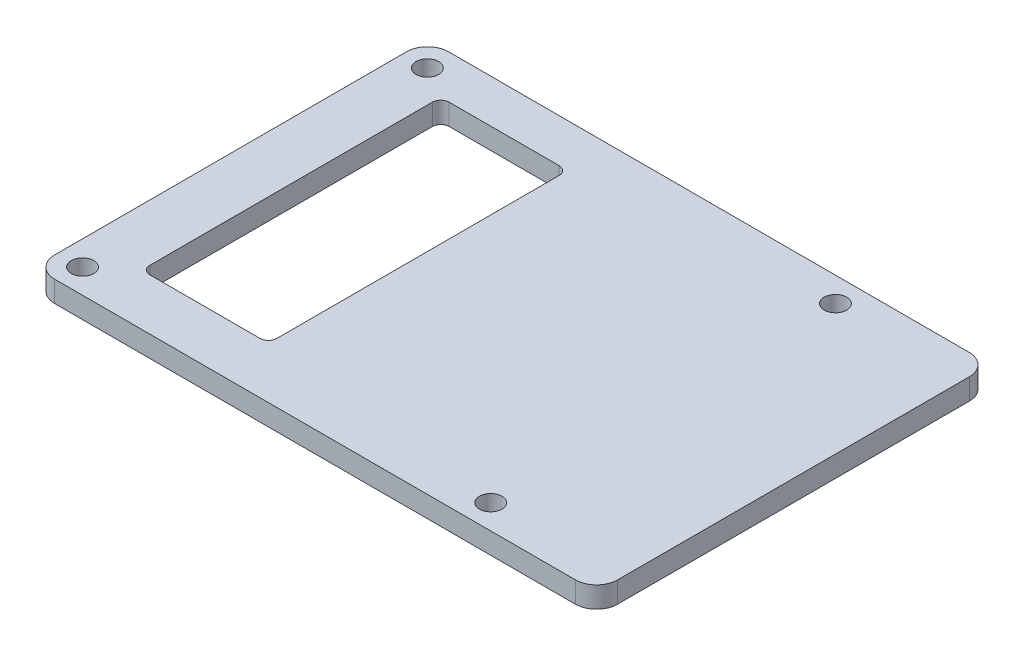
ISO-10303-21;
HEADER;
FILE_DESCRIPTION(('STEP AP214'),'2;1');
FILE_NAME('part.step','',(''),(''),'','','');
FILE_SCHEMA(('AUTOMOTIVE_DESIGN { 1 0 10303 214 1 1 1 1 }'));
ENDSEC;
DATA;
#1=APPLICATION_CONTEXT('core data for automotive mechanical design processes');
#2=APPLICATION_PROTOCOL_DEFINITION('international standard','automotive_design',2000,#1);
#3=PRODUCT_CONTEXT('',#1,'mechanical');
#4=PRODUCT('Part','Part','',(#3));
#5=PRODUCT_RELATED_PRODUCT_CATEGORY('part','',(#4));
#6=PRODUCT_DEFINITION_FORMATION('','',#4);
#7=PRODUCT_DEFINITION_CONTEXT('part definition',#1,'design');
#8=PRODUCT_DEFINITION('design','',#6,#7);
#9=PRODUCT_DEFINITION_SHAPE('','',#8);
#10=(LENGTH_UNIT() NAMED_UNIT(*) SI_UNIT(.MILLI.,.METRE.));
#11=(NAMED_UNIT(*) PLANE_ANGLE_UNIT() SI_UNIT($,.RADIAN.));
#12=(NAMED_UNIT(*) SI_UNIT($,.STERADIAN.) SOLID_ANGLE_UNIT());
#13=UNCERTAINTY_MEASURE_WITH_UNIT(LENGTH_MEASURE(1.E-05),#10,'distance_accuracy_value','');
#14=(GEOMETRIC_REPRESENTATION_CONTEXT(3) GLOBAL_UNCERTAINTY_ASSIGNED_CONTEXT((#13)) GLOBAL_UNIT_ASSIGNED_CONTEXT((#10,
#11,#12)) REPRESENTATION_CONTEXT('',''));
#15=CARTESIAN_POINT('',(0.,0.,0.));
#16=DIRECTION('',(0.,0.,1.));
#17=DIRECTION('',(1.,0.,0.));
#18=AXIS2_PLACEMENT_3D('',#15,#16,#17);
#19=CARTESIAN_POINT('',(-77.0217231267692,3.,-21.4026703774337));
#20=DIRECTION('',(0.,1.,0.));
#21=DIRECTION('',(0.,0.,1.));
#22=AXIS2_PLACEMENT_3D('',#19,#20,#21);
#23=PLANE('',#22);
#24=CARTESIAN_POINT('',(-18.5283322199872,3.,28.1136567752183));
#25=DIRECTION('',(0.,1.,0.));
#26=DIRECTION('',(0.,0.,1.));
#27=AXIS2_PLACEMENT_3D('',#24,#25,#26);
#28=CIRCLE('',#27,1.6);
#29=CARTESIAN_POINT('',(-18.5283322199872,3.,29.7136567752183));
#30=VERTEX_POINT('',#29);
#31=EDGE_CURVE('E223',#30,#30,#28,.T.);
#32=ORIENTED_EDGE('',*,*,#31,.F.);
#33=EDGE_LOOP('',(#32));
#34=FACE_BOUND('',#33,.T.);
#35=CARTESIAN_POINT('',(-76.5284846202892,3.,-20.8867242255417));
#36=DIRECTION('',(0.,1.,0.));
#37=DIRECTION('',(0.,0.,1.));
#38=AXIS2_PLACEMENT_3D('',#35,#36,#37);
#39=CIRCLE('',#38,1.6);
#40=CARTESIAN_POINT('',(-76.5284846202892,3.,-19.2867242255417));
#41=VERTEX_POINT('',#40);
#42=EDGE_CURVE('E235',#41,#41,#39,.T.);
#43=ORIENTED_EDGE('',*,*,#42,.F.);
#44=EDGE_LOOP('',(#43));
#45=FACE_BOUND('',#44,.T.);
#46=CARTESIAN_POINT('',(-77.0217231267692,3.,-21.4026703774337));
#47=DIRECTION('',(0.,1.,0.));
#48=DIRECTION('',(0.,0.,1.));
#49=AXIS2_PLACEMENT_3D('',#46,#47,#48);
#50=CIRCLE('',#49,2.98730505461);
#51=CARTESIAN_POINT('',(-77.0217231267692,3.,-24.3899754320437));
#52=VERTEX_POINT('',#51);
#53=CARTESIAN_POINT('',(-80.0090281813792,3.,-21.4026703774337));
#54=VERTEX_POINT('',#53);
#55=EDGE_CURVE('E241',#52,#54,#50,.T.);
#56=ORIENTED_EDGE('',*,*,#55,.T.);
#57=DIRECTION('',(0.,0.,1.));
#58=VECTOR('',#57,1.);
#59=CARTESIAN_POINT('',(-80.0090281813792,3.,-21.4026703774337));
#60=LINE('',#59,#58);
#61=CARTESIAN_POINT('',(-80.0090281813792,3.,28.6044314767683));
#62=VERTEX_POINT('',#61);
#63=EDGE_CURVE('E244',#54,#62,#60,.T.);
#64=ORIENTED_EDGE('',*,*,#63,.T.);
#65=CARTESIAN_POINT('',(-77.0217231267692,3.,28.6044314767683));
#66=DIRECTION('',(0.,1.,0.));
#67=DIRECTION('',(0.,0.,1.));
#68=AXIS2_PLACEMENT_3D('',#65,#66,#67);
#69=CIRCLE('',#68,2.98730505460999);
#70=CARTESIAN_POINT('',(-77.0217231267692,3.,31.5917365313783));
#71=VERTEX_POINT('',#70);
#72=EDGE_CURVE('E247',#62,#71,#69,.T.);
#73=ORIENTED_EDGE('',*,*,#72,.T.);
#74=DIRECTION('',(1.,0.,0.));
#75=VECTOR('',#74,1.);
#76=CARTESIAN_POINT('',(-77.0217231267692,3.,31.5917365313783));
#77=LINE('',#76,#75);
#78=CARTESIAN_POINT('',(-3.00902818137926,3.,31.5917365313783));
#79=VERTEX_POINT('',#78);
#80=EDGE_CURVE('E249',#71,#79,#77,.T.);
#81=ORIENTED_EDGE('',*,*,#80,.T.);
#82=CARTESIAN_POINT('',(-3.00902818137924,3.,28.5917365313783));
#83=DIRECTION('',(0.,1.,0.));
#84=DIRECTION('',(0.,0.,-1.));
#85=AXIS2_PLACEMENT_3D('',#82,#83,#84);
#86=CIRCLE('',#85,3.);
#87=CARTESIAN_POINT('',(-0.00902818137923965,3.,28.5917365313783));
#88=VERTEX_POINT('',#87);
#89=EDGE_CURVE('E251',#79,#88,#86,.T.);
#90=ORIENTED_EDGE('',*,*,#89,.T.);
#91=DIRECTION('',(0.,0.,-1.));
#92=VECTOR('',#91,1.);
#93=CARTESIAN_POINT('',(-0.00902818137923922,3.,-21.3899754320437));
#94=LINE('',#93,#92);
#95=CARTESIAN_POINT('',(-0.00902818137923922,3.,-21.3899754320437));
#96=VERTEX_POINT('',#95);
#97=EDGE_CURVE('E253',#88,#96,#94,.T.);
#98=ORIENTED_EDGE('',*,*,#97,.T.);
#99=CARTESIAN_POINT('',(-3.00902818137924,3.,-21.3899754320437));
#100=DIRECTION('',(0.,1.,0.));
#101=DIRECTION('',(0.,0.,1.));
#102=AXIS2_PLACEMENT_3D('',#99,#100,#101);
#103=CIRCLE('',#102,3.);
#104=CARTESIAN_POINT('',(-3.00902818137926,3.,-24.3899754320437));
#105=VERTEX_POINT('',#104);
#106=EDGE_CURVE('E255',#96,#105,#103,.T.);
#107=ORIENTED_EDGE('',*,*,#106,.T.);
#108=DIRECTION('',(-1.,0.,0.));
#109=VECTOR('',#108,1.);
#110=CARTESIAN_POINT('',(-3.00902818137926,3.,-24.3899754320437));
#111=LINE('',#110,#109);
#112=EDGE_CURVE('E257',#105,#52,#111,.T.);
#113=ORIENTED_EDGE('',*,*,#112,.T.);
#114=EDGE_LOOP('',(#56,#64,#73,#81,#90,#98,#107,#113));
#115=FACE_BOUND('',#114,.T.);
#116=CARTESIAN_POINT('',(-18.5285862204952,3.,-20.8865972252877));
#117=DIRECTION('',(0.,1.,0.));
#118=DIRECTION('',(0.,0.,1.));
#119=AXIS2_PLACEMENT_3D('',#116,#117,#118);
#120=CIRCLE('',#119,1.6);
#121=CARTESIAN_POINT('',(-18.5285862204952,3.,-19.2865972252877));
#122=VERTEX_POINT('',#121);
#123=EDGE_CURVE('E229',#122,#122,#120,.T.);
#124=ORIENTED_EDGE('',*,*,#123,.F.);
#125=EDGE_LOOP('',(#124));
#126=FACE_BOUND('',#125,.T.);
#127=CARTESIAN_POINT('',(-76.5283322199792,3.,28.1135297749583));
#128=DIRECTION('',(0.,1.,0.));
#129=DIRECTION('',(0.,0.,1.));
#130=AXIS2_PLACEMENT_3D('',#127,#128,#129);
#131=CIRCLE('',#130,1.6);
#132=CARTESIAN_POINT('',(-76.5283322199792,3.,29.7135297749583));
#133=VERTEX_POINT('',#132);
#134=EDGE_CURVE('E217',#133,#133,#131,.T.);
#135=ORIENTED_EDGE('',*,*,#134,.F.);
#136=EDGE_LOOP('',(#135));
#137=FACE_BOUND('',#136,.T.);
#138=DIRECTION('',(0.,0.,1.));
#139=VECTOR('',#138,1.);
#140=CARTESIAN_POINT('',(-71.9700597308106,3.,-17.03028298656));
#141=LINE('',#140,#139);
#142=CARTESIAN_POINT('',(-71.9700597308106,3.,-17.03028298656));
#143=VERTEX_POINT('',#142);
#144=CARTESIAN_POINT('',(-71.9700597308106,3.,23.0884223106065));
#145=VERTEX_POINT('',#144);
#146=EDGE_CURVE('E160',#143,#145,#141,.T.);
#147=ORIENTED_EDGE('',*,*,#146,.F.);
#148=CARTESIAN_POINT('',(-70.7700597308106,3.,-17.0302829865601));
#149=DIRECTION('',(0.,1.,0.));
#150=DIRECTION('',(0.,0.,1.));
#151=AXIS2_PLACEMENT_3D('',#148,#149,#150);
#152=CIRCLE('',#151,1.2);
#153=CARTESIAN_POINT('',(-70.7700597308106,3.,-18.2302829865601));
#154=VERTEX_POINT('',#153);
#155=EDGE_CURVE('E152',#154,#143,#152,.T.);
#156=ORIENTED_EDGE('',*,*,#155,.F.);
#157=DIRECTION('',(-1.,0.,0.));
#158=VECTOR('',#157,1.);
#159=CARTESIAN_POINT('',(-70.7700597308106,3.,-18.2302829865601));
#160=LINE('',#159,#158);
#161=CARTESIAN_POINT('',(-55.140568983521,3.,-18.2302829865601));
#162=VERTEX_POINT('',#161);
#163=EDGE_CURVE('E185',#162,#154,#160,.T.);
#164=ORIENTED_EDGE('',*,*,#163,.F.);
#165=CARTESIAN_POINT('',(-55.140568983521,3.,-17.0302829865601));
#166=DIRECTION('',(0.,1.,0.));
#167=DIRECTION('',(0.,0.,1.));
#168=AXIS2_PLACEMENT_3D('',#165,#166,#167);
#169=CIRCLE('',#168,1.2);
#170=CARTESIAN_POINT('',(-53.940568983521,3.,-17.03028298656));
#171=VERTEX_POINT('',#170);
#172=EDGE_CURVE('E183',#171,#162,#169,.T.);
#173=ORIENTED_EDGE('',*,*,#172,.F.);
#174=DIRECTION('',(0.,0.,-1.));
#175=VECTOR('',#174,1.);
#176=CARTESIAN_POINT('',(-53.940568983521,3.,-17.03028298656));
#177=LINE('',#176,#175);
#178=CARTESIAN_POINT('',(-53.940568983521,3.,23.0884223106065));
#179=VERTEX_POINT('',#178);
#180=EDGE_CURVE('E181',#179,#171,#177,.T.);
#181=ORIENTED_EDGE('',*,*,#180,.F.);
#182=CARTESIAN_POINT('',(-55.140568983521,3.,23.0884223106065));
#183=DIRECTION('',(0.,1.,0.));
#184=DIRECTION('',(0.,0.,-1.));
#185=AXIS2_PLACEMENT_3D('',#182,#183,#184);
#186=CIRCLE('',#185,1.2);
#187=CARTESIAN_POINT('',(-55.140568983521,3.,24.2884223106065));
#188=VERTEX_POINT('',#187);
#189=EDGE_CURVE('E179',#188,#179,#186,.T.);
#190=ORIENTED_EDGE('',*,*,#189,.F.);
#191=DIRECTION('',(1.,0.,0.));
#192=VECTOR('',#191,1.);
#193=CARTESIAN_POINT('',(-70.7700597308106,3.,24.2884223106065));
#194=LINE('',#193,#192);
#195=CARTESIAN_POINT('',(-70.7700597308106,3.,24.2884223106065));
#196=VERTEX_POINT('',#195);
#197=EDGE_CURVE('E175',#196,#188,#194,.T.);
#198=ORIENTED_EDGE('',*,*,#197,.F.);
#199=CARTESIAN_POINT('',(-70.7700597308106,3.,23.0884223106065));
#200=DIRECTION('',(0.,1.,0.));
#201=DIRECTION('',(0.,0.,-1.));
#202=AXIS2_PLACEMENT_3D('',#199,#200,#201);
#203=CIRCLE('',#202,1.2);
#204=EDGE_CURVE('E173',#145,#196,#203,.T.);
#205=ORIENTED_EDGE('',*,*,#204,.F.);
#206=EDGE_LOOP('',(#147,#156,#164,#173,#181,#190,#198,#205));
#207=FACE_BOUND('',#206,.T.);
#208=ADVANCED_FACE('F39',(#34,#45,#115,#126,#137,#207),#23,.T.);
#209=CARTESIAN_POINT('',(-77.0217231267692,0.,-21.4026703774337));
#210=DIRECTION('',(0.,1.,0.));
#211=DIRECTION('',(0.,0.,1.));
#212=AXIS2_PLACEMENT_3D('',#209,#210,#211);
#213=PLANE('',#212);
#214=CARTESIAN_POINT('',(-76.5283322199792,0.,28.1135297749583));
#215=DIRECTION('',(0.,1.,0.));
#216=DIRECTION('',(0.,0.,1.));
#217=AXIS2_PLACEMENT_3D('',#214,#215,#216);
#218=CIRCLE('',#217,1.6);
#219=CARTESIAN_POINT('',(-76.5283322199792,0.,29.7135297749583));
#220=VERTEX_POINT('',#219);
#221=EDGE_CURVE('E168',#220,#220,#218,.T.);
#222=ORIENTED_EDGE('',*,*,#221,.T.);
#223=EDGE_LOOP('',(#222));
#224=FACE_BOUND('',#223,.T.);
#225=CARTESIAN_POINT('',(-18.5283322199872,0.,28.1136567752183));
#226=DIRECTION('',(0.,1.,0.));
#227=DIRECTION('',(0.,0.,1.));
#228=AXIS2_PLACEMENT_3D('',#225,#226,#227);
#229=CIRCLE('',#228,1.6);
#230=CARTESIAN_POINT('',(-18.5283322199872,0.,29.7136567752183));
#231=VERTEX_POINT('',#230);
#232=EDGE_CURVE('E220',#231,#231,#229,.T.);
#233=ORIENTED_EDGE('',*,*,#232,.T.);
#234=EDGE_LOOP('',(#233));
#235=FACE_BOUND('',#234,.T.);
#236=CARTESIAN_POINT('',(-18.5285862204952,0.,-20.8865972252877));
#237=DIRECTION('',(0.,1.,0.));
#238=DIRECTION('',(0.,0.,1.));
#239=AXIS2_PLACEMENT_3D('',#236,#237,#238);
#240=CIRCLE('',#239,1.6);
#241=CARTESIAN_POINT('',(-18.5285862204952,0.,-19.2865972252877));
#242=VERTEX_POINT('',#241);
#243=EDGE_CURVE('E226',#242,#242,#240,.T.);
#244=ORIENTED_EDGE('',*,*,#243,.T.);
#245=EDGE_LOOP('',(#244));
#246=FACE_BOUND('',#245,.T.);
#247=CARTESIAN_POINT('',(-76.5284846202892,0.,-20.8867242255417));
#248=DIRECTION('',(0.,1.,0.));
#249=DIRECTION('',(0.,0.,1.));
#250=AXIS2_PLACEMENT_3D('',#247,#248,#249);
#251=CIRCLE('',#250,1.6);
#252=CARTESIAN_POINT('',(-76.5284846202892,0.,-19.2867242255417));
#253=VERTEX_POINT('',#252);
#254=EDGE_CURVE('E232',#253,#253,#251,.T.);
#255=ORIENTED_EDGE('',*,*,#254,.T.);
#256=EDGE_LOOP('',(#255));
#257=FACE_BOUND('',#256,.T.);
#258=CARTESIAN_POINT('',(-77.0217231267692,0.,-21.4026703774337));
#259=DIRECTION('',(0.,1.,0.));
#260=DIRECTION('',(0.,0.,1.));
#261=AXIS2_PLACEMENT_3D('',#258,#259,#260);
#262=CIRCLE('',#261,2.98730505461);
#263=CARTESIAN_POINT('',(-77.0217231267692,0.,-24.3899754320437));
#264=VERTEX_POINT('',#263);
#265=CARTESIAN_POINT('',(-80.0090281813792,0.,-21.4026703774337));
#266=VERTEX_POINT('',#265);
#267=EDGE_CURVE('E238',#264,#266,#262,.T.);
#268=ORIENTED_EDGE('',*,*,#267,.F.);
#269=DIRECTION('',(-1.,0.,0.));
#270=VECTOR('',#269,1.);
#271=CARTESIAN_POINT('',(-3.00902818137926,0.,-24.3899754320437));
#272=LINE('',#271,#270);
#273=CARTESIAN_POINT('',(-3.00902818137926,0.,-24.3899754320437));
#274=VERTEX_POINT('',#273);
#275=EDGE_CURVE('E245',#274,#264,#272,.T.);
#276=ORIENTED_EDGE('',*,*,#275,.F.);
#277=CARTESIAN_POINT('',(-3.00902818137924,0.,-21.3899754320437));
#278=DIRECTION('',(0.,1.,0.));
#279=DIRECTION('',(0.,0.,1.));
#280=AXIS2_PLACEMENT_3D('',#277,#278,#279);
#281=CIRCLE('',#280,3.);
#282=CARTESIAN_POINT('',(-0.00902818137923922,0.,-21.3899754320437));
#283=VERTEX_POINT('',#282);
#284=EDGE_CURVE('E272',#283,#274,#281,.T.);
#285=ORIENTED_EDGE('',*,*,#284,.F.);
#286=DIRECTION('',(0.,0.,-1.));
#287=VECTOR('',#286,1.);
#288=CARTESIAN_POINT('',(-0.00902818137923922,0.,-21.3899754320437));
#289=LINE('',#288,#287);
#290=CARTESIAN_POINT('',(-0.00902818137923965,0.,28.5917365313783));
#291=VERTEX_POINT('',#290);
#292=EDGE_CURVE('E270',#291,#283,#289,.T.);
#293=ORIENTED_EDGE('',*,*,#292,.F.);
#294=CARTESIAN_POINT('',(-3.00902818137924,0.,28.5917365313783));
#295=DIRECTION('',(0.,1.,0.));
#296=DIRECTION('',(0.,0.,-1.));
#297=AXIS2_PLACEMENT_3D('',#294,#295,#296);
#298=CIRCLE('',#297,3.);
#299=CARTESIAN_POINT('',(-3.00902818137926,0.,31.5917365313783));
#300=VERTEX_POINT('',#299);
#301=EDGE_CURVE('E268',#300,#291,#298,.T.);
#302=ORIENTED_EDGE('',*,*,#301,.F.);
#303=DIRECTION('',(1.,0.,0.));
#304=VECTOR('',#303,1.);
#305=CARTESIAN_POINT('',(-77.0217231267692,0.,31.5917365313783));
#306=LINE('',#305,#304);
#307=CARTESIAN_POINT('',(-77.0217231267692,0.,31.5917365313783));
#308=VERTEX_POINT('',#307);
#309=EDGE_CURVE('E266',#308,#300,#306,.T.);
#310=ORIENTED_EDGE('',*,*,#309,.F.);
#311=CARTESIAN_POINT('',(-77.0217231267692,0.,28.6044314767683));
#312=DIRECTION('',(0.,1.,0.));
#313=DIRECTION('',(0.,0.,1.));
#314=AXIS2_PLACEMENT_3D('',#311,#312,#313);
#315=CIRCLE('',#314,2.98730505460999);
#316=CARTESIAN_POINT('',(-80.0090281813792,0.,28.6044314767683));
#317=VERTEX_POINT('',#316);
#318=EDGE_CURVE('E264',#317,#308,#315,.T.);
#319=ORIENTED_EDGE('',*,*,#318,.F.);
#320=DIRECTION('',(0.,0.,1.));
#321=VECTOR('',#320,1.);
#322=CARTESIAN_POINT('',(-80.0090281813792,0.,-21.4026703774337));
#323=LINE('',#322,#321);
#324=EDGE_CURVE('E262',#266,#317,#323,.T.);
#325=ORIENTED_EDGE('',*,*,#324,.F.);
#326=EDGE_LOOP('',(#268,#276,#285,#293,#302,#310,#319,#325));
#327=FACE_BOUND('',#326,.T.);
#328=CARTESIAN_POINT('',(-70.7700597308106,0.,-17.0302829865601));
#329=DIRECTION('',(0.,1.,0.));
#330=DIRECTION('',(0.,0.,1.));
#331=AXIS2_PLACEMENT_3D('',#328,#329,#330);
#332=CIRCLE('',#331,1.2);
#333=CARTESIAN_POINT('',(-70.7700597308106,0.,-18.2302829865601));
#334=VERTEX_POINT('',#333);
#335=CARTESIAN_POINT('',(-71.9700597308106,0.,-17.03028298656));
#336=VERTEX_POINT('',#335);
#337=EDGE_CURVE('E62',#334,#336,#332,.T.);
#338=ORIENTED_EDGE('',*,*,#337,.T.);
#339=DIRECTION('',(0.,0.,1.));
#340=VECTOR('',#339,1.);
#341=CARTESIAN_POINT('',(-71.9700597308106,0.,-17.03028298656));
#342=LINE('',#341,#340);
#343=CARTESIAN_POINT('',(-71.9700597308106,0.,23.0884223106065));
#344=VERTEX_POINT('',#343);
#345=EDGE_CURVE('E167',#336,#344,#342,.T.);
#346=ORIENTED_EDGE('',*,*,#345,.T.);
#347=CARTESIAN_POINT('',(-70.7700597308106,0.,23.0884223106065));
#348=DIRECTION('',(0.,1.,0.));
#349=DIRECTION('',(0.,0.,-1.));
#350=AXIS2_PLACEMENT_3D('',#347,#348,#349);
#351=CIRCLE('',#350,1.2);
#352=CARTESIAN_POINT('',(-70.7700597308106,0.,24.2884223106065));
#353=VERTEX_POINT('',#352);
#354=EDGE_CURVE('E189',#344,#353,#351,.T.);
#355=ORIENTED_EDGE('',*,*,#354,.T.);
#356=DIRECTION('',(1.,0.,0.));
#357=VECTOR('',#356,1.);
#358=CARTESIAN_POINT('',(-70.7700597308106,0.,24.2884223106065));
#359=LINE('',#358,#357);
#360=CARTESIAN_POINT('',(-55.140568983521,0.,24.2884223106065));
#361=VERTEX_POINT('',#360);
#362=EDGE_CURVE('E192',#353,#361,#359,.T.);
#363=ORIENTED_EDGE('',*,*,#362,.T.);
#364=CARTESIAN_POINT('',(-55.140568983521,0.,23.0884223106065));
#365=DIRECTION('',(0.,1.,0.));
#366=DIRECTION('',(0.,0.,-1.));
#367=AXIS2_PLACEMENT_3D('',#364,#365,#366);
#368=CIRCLE('',#367,1.2);
#369=CARTESIAN_POINT('',(-53.940568983521,0.,23.0884223106065));
#370=VERTEX_POINT('',#369);
#371=EDGE_CURVE('E195',#361,#370,#368,.T.);
#372=ORIENTED_EDGE('',*,*,#371,.T.);
#373=DIRECTION('',(0.,0.,-1.));
#374=VECTOR('',#373,1.);
#375=CARTESIAN_POINT('',(-53.940568983521,0.,-17.03028298656));
#376=LINE('',#375,#374);
#377=CARTESIAN_POINT('',(-53.940568983521,0.,-17.03028298656));
#378=VERTEX_POINT('',#377);
#379=EDGE_CURVE('E198',#370,#378,#376,.T.);
#380=ORIENTED_EDGE('',*,*,#379,.T.);
#381=CARTESIAN_POINT('',(-55.140568983521,0.,-17.0302829865601));
#382=DIRECTION('',(0.,1.,0.));
#383=DIRECTION('',(0.,0.,1.));
#384=AXIS2_PLACEMENT_3D('',#381,#382,#383);
#385=CIRCLE('',#384,1.2);
#386=CARTESIAN_POINT('',(-55.140568983521,0.,-18.2302829865601));
#387=VERTEX_POINT('',#386);
#388=EDGE_CURVE('E201',#378,#387,#385,.T.);
#389=ORIENTED_EDGE('',*,*,#388,.T.);
#390=DIRECTION('',(-1.,0.,0.));
#391=VECTOR('',#390,1.);
#392=CARTESIAN_POINT('',(-70.7700597308106,0.,-18.2302829865601));
#393=LINE('',#392,#391);
#394=EDGE_CURVE('E161',#387,#334,#393,.T.);
#395=ORIENTED_EDGE('',*,*,#394,.T.);
#396=EDGE_LOOP('',(#338,#346,#355,#363,#372,#380,#389,#395));
#397=FACE_BOUND('',#396,.T.);
#398=ADVANCED_FACE('F302',(#224,#235,#246,#257,#327,#397),#213,.F.);
#399=CARTESIAN_POINT('',(-77.0217231267692,3.,-21.4026703774337));
#400=DIRECTION('',(0.,-1.,0.));
#401=DIRECTION('',(0.,0.,-1.));
#402=AXIS2_PLACEMENT_3D('',#399,#400,#401);
#403=CYLINDRICAL_SURFACE('',#402,2.98730505461);
#404=ORIENTED_EDGE('',*,*,#267,.T.);
#405=DIRECTION('',(0.,-1.,0.));
#406=VECTOR('',#405,1.);
#407=CARTESIAN_POINT('',(-80.0090281813792,3.,-21.4026703774337));
#408=LINE('',#407,#406);
#409=EDGE_CURVE('E11',#54,#266,#408,.T.);
#410=ORIENTED_EDGE('',*,*,#409,.F.);
#411=ORIENTED_EDGE('',*,*,#55,.F.);
#412=DIRECTION('',(0.,-1.,0.));
#413=VECTOR('',#412,1.);
#414=CARTESIAN_POINT('',(-77.0217231267692,3.,-24.3899754320437));
#415=LINE('',#414,#413);
#416=EDGE_CURVE('E259',#52,#264,#415,.T.);
#417=ORIENTED_EDGE('',*,*,#416,.T.);
#418=EDGE_LOOP('',(#404,#410,#411,#417));
#419=FACE_BOUND('',#418,.T.);
#420=ADVANCED_FACE('F41',(#419),#403,.T.);
#421=CARTESIAN_POINT('',(-80.0090281813792,3.,-21.4026703774337));
#422=DIRECTION('',(1.,0.,0.));
#423=DIRECTION('',(0.,0.,-1.));
#424=AXIS2_PLACEMENT_3D('',#421,#422,#423);
#425=PLANE('',#424);
#426=ORIENTED_EDGE('',*,*,#324,.T.);
#427=DIRECTION('',(0.,-1.,0.));
#428=VECTOR('',#427,1.);
#429=CARTESIAN_POINT('',(-80.0090281813792,3.,28.6044314767683));
#430=LINE('',#429,#428);
#431=EDGE_CURVE('E47',#62,#317,#430,.T.);
#432=ORIENTED_EDGE('',*,*,#431,.F.);
#433=ORIENTED_EDGE('',*,*,#63,.F.);
#434=ORIENTED_EDGE('',*,*,#409,.T.);
#435=EDGE_LOOP('',(#426,#432,#433,#434));
#436=FACE_BOUND('',#435,.T.);
#437=ADVANCED_FACE('F320',(#436),#425,.F.);
#438=CARTESIAN_POINT('',(-77.0217231267692,3.,28.6044314767683));
#439=DIRECTION('',(0.,-1.,0.));
#440=DIRECTION('',(0.,0.,-1.));
#441=AXIS2_PLACEMENT_3D('',#438,#439,#440);
#442=CYLINDRICAL_SURFACE('',#441,2.98730505460999);
#443=ORIENTED_EDGE('',*,*,#318,.T.);
#444=DIRECTION('',(0.,-1.,0.));
#445=VECTOR('',#444,1.);
#446=CARTESIAN_POINT('',(-77.0217231267692,3.,31.5917365313783));
#447=LINE('',#446,#445);
#448=EDGE_CURVE('E289',#71,#308,#447,.T.);
#449=ORIENTED_EDGE('',*,*,#448,.F.);
#450=ORIENTED_EDGE('',*,*,#72,.F.);
#451=ORIENTED_EDGE('',*,*,#431,.T.);
#452=EDGE_LOOP('',(#443,#449,#450,#451));
#453=FACE_BOUND('',#452,.T.);
#454=ADVANCED_FACE('F296',(#453),#442,.T.);
#455=CARTESIAN_POINT('',(-77.0217231267692,3.,31.5917365313783));
#456=DIRECTION('',(0.,0.,-1.));
#457=DIRECTION('',(-1.,0.,0.));
#458=AXIS2_PLACEMENT_3D('',#455,#456,#457);
#459=PLANE('',#458);
#460=ORIENTED_EDGE('',*,*,#309,.T.);
#461=DIRECTION('',(0.,-1.,0.));
#462=VECTOR('',#461,1.);
#463=CARTESIAN_POINT('',(-3.00902818137926,3.,31.5917365313783));
#464=LINE('',#463,#462);
#465=EDGE_CURVE('E286',#79,#300,#464,.T.);
#466=ORIENTED_EDGE('',*,*,#465,.F.);
#467=ORIENTED_EDGE('',*,*,#80,.F.);
#468=ORIENTED_EDGE('',*,*,#448,.T.);
#469=EDGE_LOOP('',(#460,#466,#467,#468));
#470=FACE_BOUND('',#469,.T.);
#471=ADVANCED_FACE('F308',(#470),#459,.F.);
#472=CARTESIAN_POINT('',(-3.00902818137924,3.,28.5917365313783));
#473=DIRECTION('',(0.,-1.,0.));
#474=DIRECTION('',(0.,0.,-1.));
#475=AXIS2_PLACEMENT_3D('',#472,#473,#474);
#476=CYLINDRICAL_SURFACE('',#475,3.);
#477=ORIENTED_EDGE('',*,*,#301,.T.);
#478=DIRECTION('',(0.,-1.,0.));
#479=VECTOR('',#478,1.);
#480=CARTESIAN_POINT('',(-0.00902818137923965,3.,28.5917365313783));
#481=LINE('',#480,#479);
#482=EDGE_CURVE('E283',#88,#291,#481,.T.);
#483=ORIENTED_EDGE('',*,*,#482,.F.);
#484=ORIENTED_EDGE('',*,*,#89,.F.);
#485=ORIENTED_EDGE('',*,*,#465,.T.);
#486=EDGE_LOOP('',(#477,#483,#484,#485));
#487=FACE_BOUND('',#486,.T.);
#488=ADVANCED_FACE('F312',(#487),#476,.T.);
#489=CARTESIAN_POINT('',(-0.00902818137923922,3.,-21.3899754320437));
#490=DIRECTION('',(-1.,0.,0.));
#491=DIRECTION('',(0.,0.,1.));
#492=AXIS2_PLACEMENT_3D('',#489,#490,#491);
#493=PLANE('',#492);
#494=ORIENTED_EDGE('',*,*,#292,.T.);
#495=DIRECTION('',(0.,-1.,0.));
#496=VECTOR('',#495,1.);
#497=CARTESIAN_POINT('',(-0.00902818137923922,3.,-21.3899754320437));
#498=LINE('',#497,#496);
#499=EDGE_CURVE('E280',#96,#283,#498,.T.);
#500=ORIENTED_EDGE('',*,*,#499,.F.);
#501=ORIENTED_EDGE('',*,*,#97,.F.);
#502=ORIENTED_EDGE('',*,*,#482,.T.);
#503=EDGE_LOOP('',(#494,#500,#501,#502));
#504=FACE_BOUND('',#503,.T.);
#505=ADVANCED_FACE('F333',(#504),#493,.F.);
#506=CARTESIAN_POINT('',(-3.00902818137924,3.,-21.3899754320437));
#507=DIRECTION('',(0.,-1.,0.));
#508=DIRECTION('',(0.,0.,-1.));
#509=AXIS2_PLACEMENT_3D('',#506,#507,#508);
#510=CYLINDRICAL_SURFACE('',#509,3.);
#511=ORIENTED_EDGE('',*,*,#284,.T.);
#512=DIRECTION('',(0.,-1.,0.));
#513=VECTOR('',#512,1.);
#514=CARTESIAN_POINT('',(-3.00902818137926,3.,-24.3899754320437));
#515=LINE('',#514,#513);
#516=EDGE_CURVE('E277',#105,#274,#515,.T.);
#517=ORIENTED_EDGE('',*,*,#516,.F.);
#518=ORIENTED_EDGE('',*,*,#106,.F.);
#519=ORIENTED_EDGE('',*,*,#499,.T.);
#520=EDGE_LOOP('',(#511,#517,#518,#519));
#521=FACE_BOUND('',#520,.T.);
#522=ADVANCED_FACE('F331',(#521),#510,.T.);
#523=CARTESIAN_POINT('',(-3.00902818137926,3.,-24.3899754320437));
#524=DIRECTION('',(0.,0.,1.));
#525=DIRECTION('',(1.,0.,0.));
#526=AXIS2_PLACEMENT_3D('',#523,#524,#525);
#527=PLANE('',#526);
#528=ORIENTED_EDGE('',*,*,#275,.T.);
#529=ORIENTED_EDGE('',*,*,#416,.F.);
#530=ORIENTED_EDGE('',*,*,#112,.F.);
#531=ORIENTED_EDGE('',*,*,#516,.T.);
#532=EDGE_LOOP('',(#528,#529,#530,#531));
#533=FACE_BOUND('',#532,.T.);
#534=ADVANCED_FACE('F326',(#533),#527,.F.);
#535=CARTESIAN_POINT('',(-76.5284846202892,3.,-20.8867242255417));
#536=DIRECTION('',(0.,-1.,0.));
#537=DIRECTION('',(0.,0.,-1.));
#538=AXIS2_PLACEMENT_3D('',#535,#536,#537);
#539=CYLINDRICAL_SURFACE('',#538,1.6);
#540=ORIENTED_EDGE('',*,*,#42,.T.);
#541=EDGE_LOOP('',(#540));
#542=FACE_BOUND('',#541,.T.);
#543=ORIENTED_EDGE('',*,*,#254,.F.);
#544=EDGE_LOOP('',(#543));
#545=FACE_BOUND('',#544,.T.);
#546=ADVANCED_FACE('F353',(#542,#545),#539,.F.);
#547=CARTESIAN_POINT('',(-18.5285862204952,3.,-20.8865972252877));
#548=DIRECTION('',(0.,-1.,0.));
#549=DIRECTION('',(0.,0.,-1.));
#550=AXIS2_PLACEMENT_3D('',#547,#548,#549);
#551=CYLINDRICAL_SURFACE('',#550,1.6);
#552=ORIENTED_EDGE('',*,*,#123,.T.);
#553=EDGE_LOOP('',(#552));
#554=FACE_BOUND('',#553,.T.);
#555=ORIENTED_EDGE('',*,*,#243,.F.);
#556=EDGE_LOOP('',(#555));
#557=FACE_BOUND('',#556,.T.);
#558=ADVANCED_FACE('F360',(#554,#557),#551,.F.);
#559=CARTESIAN_POINT('',(-18.5283322199872,3.,28.1136567752183));
#560=DIRECTION('',(0.,-1.,0.));
#561=DIRECTION('',(0.,0.,-1.));
#562=AXIS2_PLACEMENT_3D('',#559,#560,#561);
#563=CYLINDRICAL_SURFACE('',#562,1.6);
#564=ORIENTED_EDGE('',*,*,#31,.T.);
#565=EDGE_LOOP('',(#564));
#566=FACE_BOUND('',#565,.T.);
#567=ORIENTED_EDGE('',*,*,#232,.F.);
#568=EDGE_LOOP('',(#567));
#569=FACE_BOUND('',#568,.T.);
#570=ADVANCED_FACE('F365',(#566,#569),#563,.F.);
#571=CARTESIAN_POINT('',(-76.5283322199792,3.,28.1135297749583));
#572=DIRECTION('',(0.,-1.,0.));
#573=DIRECTION('',(0.,0.,-1.));
#574=AXIS2_PLACEMENT_3D('',#571,#572,#573);
#575=CYLINDRICAL_SURFACE('',#574,1.6);
#576=ORIENTED_EDGE('',*,*,#134,.T.);
#577=EDGE_LOOP('',(#576));
#578=FACE_BOUND('',#577,.T.);
#579=ORIENTED_EDGE('',*,*,#221,.F.);
#580=EDGE_LOOP('',(#579));
#581=FACE_BOUND('',#580,.T.);
#582=ADVANCED_FACE('F374',(#578,#581),#575,.F.);
#583=CARTESIAN_POINT('',(-70.7700597308106,3.,-17.0302829865601));
#584=DIRECTION('',(0.,-1.,0.));
#585=DIRECTION('',(0.,0.,-1.));
#586=AXIS2_PLACEMENT_3D('',#583,#584,#585);
#587=CYLINDRICAL_SURFACE('',#586,1.2);
#588=ORIENTED_EDGE('',*,*,#337,.F.);
#589=DIRECTION('',(0.,-1.,0.));
#590=VECTOR('',#589,1.);
#591=CARTESIAN_POINT('',(-70.7700597308106,3.,-18.2302829865601));
#592=LINE('',#591,#590);
#593=EDGE_CURVE('E156',#154,#334,#592,.T.);
#594=ORIENTED_EDGE('',*,*,#593,.F.);
#595=ORIENTED_EDGE('',*,*,#155,.T.);
#596=DIRECTION('',(0.,-1.,0.));
#597=VECTOR('',#596,1.);
#598=CARTESIAN_POINT('',(-71.9700597308106,3.,-17.03028298656));
#599=LINE('',#598,#597);
#600=EDGE_CURVE('E155',#143,#336,#599,.T.);
#601=ORIENTED_EDGE('',*,*,#600,.T.);
#602=EDGE_LOOP('',(#588,#594,#595,#601));
#603=FACE_BOUND('',#602,.T.);
#604=ADVANCED_FACE('F154',(#603),#587,.F.);
#605=CARTESIAN_POINT('',(-71.9700597308106,3.,-17.03028298656));
#606=DIRECTION('',(1.,0.,0.));
#607=DIRECTION('',(0.,0.,-1.));
#608=AXIS2_PLACEMENT_3D('',#605,#606,#607);
#609=PLANE('',#608);
#610=ORIENTED_EDGE('',*,*,#345,.F.);
#611=ORIENTED_EDGE('',*,*,#600,.F.);
#612=ORIENTED_EDGE('',*,*,#146,.T.);
#613=DIRECTION('',(0.,-1.,0.));
#614=VECTOR('',#613,1.);
#615=CARTESIAN_POINT('',(-71.9700597308106,3.,23.0884223106065));
#616=LINE('',#615,#614);
#617=EDGE_CURVE('E169',#145,#344,#616,.T.);
#618=ORIENTED_EDGE('',*,*,#617,.T.);
#619=EDGE_LOOP('',(#610,#611,#612,#618));
#620=FACE_BOUND('',#619,.T.);
#621=ADVANCED_FACE('F164',(#620),#609,.T.);
#622=CARTESIAN_POINT('',(-70.7700597308106,3.,23.0884223106065));
#623=DIRECTION('',(0.,-1.,0.));
#624=DIRECTION('',(0.,0.,-1.));
#625=AXIS2_PLACEMENT_3D('',#622,#623,#624);
#626=CYLINDRICAL_SURFACE('',#625,1.2);
#627=ORIENTED_EDGE('',*,*,#354,.F.);
#628=ORIENTED_EDGE('',*,*,#617,.F.);
#629=ORIENTED_EDGE('',*,*,#204,.T.);
#630=DIRECTION('',(0.,-1.,0.));
#631=VECTOR('',#630,1.);
#632=CARTESIAN_POINT('',(-70.7700597308106,3.,24.2884223106065));
#633=LINE('',#632,#631);
#634=EDGE_CURVE('E214',#196,#353,#633,.T.);
#635=ORIENTED_EDGE('',*,*,#634,.T.);
#636=EDGE_LOOP('',(#627,#628,#629,#635));
#637=FACE_BOUND('',#636,.T.);
#638=ADVANCED_FACE('F386',(#637),#626,.F.);
#639=CARTESIAN_POINT('',(-70.7700597308106,3.,24.2884223106065));
#640=DIRECTION('',(0.,0.,-1.));
#641=DIRECTION('',(-1.,0.,0.));
#642=AXIS2_PLACEMENT_3D('',#639,#640,#641);
#643=PLANE('',#642);
#644=ORIENTED_EDGE('',*,*,#362,.F.);
#645=ORIENTED_EDGE('',*,*,#634,.F.);
#646=ORIENTED_EDGE('',*,*,#197,.T.);
#647=DIRECTION('',(0.,-1.,0.));
#648=VECTOR('',#647,1.);
#649=CARTESIAN_POINT('',(-55.140568983521,3.,24.2884223106065));
#650=LINE('',#649,#648);
#651=EDGE_CURVE('E212',#188,#361,#650,.T.);
#652=ORIENTED_EDGE('',*,*,#651,.T.);
#653=EDGE_LOOP('',(#644,#645,#646,#652));
#654=FACE_BOUND('',#653,.T.);
#655=ADVANCED_FACE('F389',(#654),#643,.T.);
#656=CARTESIAN_POINT('',(-55.140568983521,3.,23.0884223106065));
#657=DIRECTION('',(0.,-1.,0.));
#658=DIRECTION('',(0.,0.,-1.));
#659=AXIS2_PLACEMENT_3D('',#656,#657,#658);
#660=CYLINDRICAL_SURFACE('',#659,1.2);
#661=ORIENTED_EDGE('',*,*,#371,.F.);
#662=ORIENTED_EDGE('',*,*,#651,.F.);
#663=ORIENTED_EDGE('',*,*,#189,.T.);
#664=DIRECTION('',(0.,-1.,0.));
#665=VECTOR('',#664,1.);
#666=CARTESIAN_POINT('',(-53.940568983521,3.,23.0884223106065));
#667=LINE('',#666,#665);
#668=EDGE_CURVE('E210',#179,#370,#667,.T.);
#669=ORIENTED_EDGE('',*,*,#668,.T.);
#670=EDGE_LOOP('',(#661,#662,#663,#669));
#671=FACE_BOUND('',#670,.T.);
#672=ADVANCED_FACE('F393',(#671),#660,.F.);
#673=CARTESIAN_POINT('',(-53.940568983521,3.,-17.03028298656));
#674=DIRECTION('',(-1.,0.,0.));
#675=DIRECTION('',(0.,0.,1.));
#676=AXIS2_PLACEMENT_3D('',#673,#674,#675);
#677=PLANE('',#676);
#678=ORIENTED_EDGE('',*,*,#379,.F.);
#679=ORIENTED_EDGE('',*,*,#668,.F.);
#680=ORIENTED_EDGE('',*,*,#180,.T.);
#681=DIRECTION('',(0.,-1.,0.));
#682=VECTOR('',#681,1.);
#683=CARTESIAN_POINT('',(-53.940568983521,3.,-17.03028298656));
#684=LINE('',#683,#682);
#685=EDGE_CURVE('E208',#171,#378,#684,.T.);
#686=ORIENTED_EDGE('',*,*,#685,.T.);
#687=EDGE_LOOP('',(#678,#679,#680,#686));
#688=FACE_BOUND('',#687,.T.);
#689=ADVANCED_FACE('F397',(#688),#677,.T.);
#690=CARTESIAN_POINT('',(-55.140568983521,3.,-17.0302829865601));
#691=DIRECTION('',(0.,-1.,0.));
#692=DIRECTION('',(0.,0.,-1.));
#693=AXIS2_PLACEMENT_3D('',#690,#691,#692);
#694=CYLINDRICAL_SURFACE('',#693,1.2);
#695=ORIENTED_EDGE('',*,*,#388,.F.);
#696=ORIENTED_EDGE('',*,*,#685,.F.);
#697=ORIENTED_EDGE('',*,*,#172,.T.);
#698=DIRECTION('',(0.,-1.,0.));
#699=VECTOR('',#698,1.);
#700=CARTESIAN_POINT('',(-55.140568983521,3.,-18.2302829865601));
#701=LINE('',#700,#699);
#702=EDGE_CURVE('E54',#162,#387,#701,.T.);
#703=ORIENTED_EDGE('',*,*,#702,.T.);
#704=EDGE_LOOP('',(#695,#696,#697,#703));
#705=FACE_BOUND('',#704,.T.);
#706=ADVANCED_FACE('F401',(#705),#694,.F.);
#707=CARTESIAN_POINT('',(-70.7700597308106,3.,-18.2302829865601));
#708=DIRECTION('',(0.,0.,1.));
#709=DIRECTION('',(1.,0.,0.));
#710=AXIS2_PLACEMENT_3D('',#707,#708,#709);
#711=PLANE('',#710);
#712=ORIENTED_EDGE('',*,*,#394,.F.);
#713=ORIENTED_EDGE('',*,*,#702,.F.);
#714=ORIENTED_EDGE('',*,*,#163,.T.);
#715=ORIENTED_EDGE('',*,*,#593,.T.);
#716=EDGE_LOOP('',(#712,#713,#714,#715));
#717=FACE_BOUND('',#716,.T.);
#718=ADVANCED_FACE('F405',(#717),#711,.T.);
#719=CLOSED_SHELL('',(#208,#398,#420,#437,#454,#471,#488,#505,#522,#534,#546,#558,#570,#582,
#604,#621,#638,#655,#672,#689,#706,#718));
#720=MANIFOLD_SOLID_BREP('B2',#719);
#721=ADVANCED_BREP_SHAPE_REPRESENTATION('',(#18,#720),#14);
#722=SHAPE_DEFINITION_REPRESENTATION(#9,#721);
ENDSEC;
END-ISO-10303-21;
